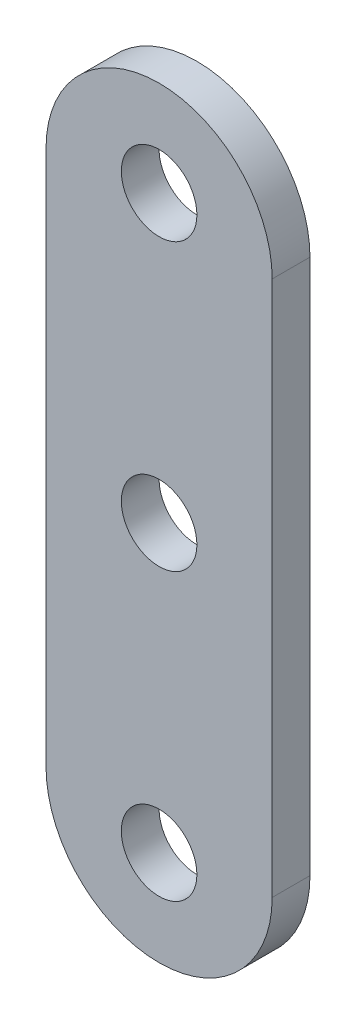
ISO-10303-21;
HEADER;
FILE_DESCRIPTION(('STEP AP214'),'2;1');
FILE_NAME('part.step','',(''),(''),'','','');
FILE_SCHEMA(('AUTOMOTIVE_DESIGN { 1 0 10303 214 1 1 1 1 }'));
ENDSEC;
DATA;
#1=APPLICATION_CONTEXT('core data for automotive mechanical design processes');
#2=APPLICATION_PROTOCOL_DEFINITION('international standard','automotive_design',2000,#1);
#3=PRODUCT_CONTEXT('',#1,'mechanical');
#4=PRODUCT('Part','Part','',(#3));
#5=PRODUCT_RELATED_PRODUCT_CATEGORY('part','',(#4));
#6=PRODUCT_DEFINITION_FORMATION('','',#4);
#7=PRODUCT_DEFINITION_CONTEXT('part definition',#1,'design');
#8=PRODUCT_DEFINITION('design','',#6,#7);
#9=PRODUCT_DEFINITION_SHAPE('','',#8);
#10=(LENGTH_UNIT() NAMED_UNIT(*) SI_UNIT(.MILLI.,.METRE.));
#11=(NAMED_UNIT(*) PLANE_ANGLE_UNIT() SI_UNIT($,.RADIAN.));
#12=(NAMED_UNIT(*) SI_UNIT($,.STERADIAN.) SOLID_ANGLE_UNIT());
#13=UNCERTAINTY_MEASURE_WITH_UNIT(LENGTH_MEASURE(1.E-05),#10,'distance_accuracy_value','');
#14=(GEOMETRIC_REPRESENTATION_CONTEXT(3) GLOBAL_UNCERTAINTY_ASSIGNED_CONTEXT((#13)) GLOBAL_UNIT_ASSIGNED_CONTEXT((#10,
#11,#12)) REPRESENTATION_CONTEXT('',''));
#15=CARTESIAN_POINT('',(0.,0.,0.));
#16=DIRECTION('',(0.,0.,1.));
#17=DIRECTION('',(1.,0.,0.));
#18=AXIS2_PLACEMENT_3D('',#15,#16,#17);
#19=CARTESIAN_POINT('',(0.,-22.5,3.175));
#20=DIRECTION('',(0.,0.,-1.));
#21=DIRECTION('',(-1.,0.,0.));
#22=AXIS2_PLACEMENT_3D('',#19,#20,#21);
#23=CYLINDRICAL_SURFACE('',#22,9.50000000000001);
#24=CARTESIAN_POINT('',(0.,-22.5,0.));
#25=DIRECTION('',(0.,0.,1.));
#26=DIRECTION('',(1.,0.,0.));
#27=AXIS2_PLACEMENT_3D('',#24,#25,#26);
#28=CIRCLE('',#27,9.50000000000001);
#29=CARTESIAN_POINT('',(-9.50000000000001,-22.5,0.));
#30=VERTEX_POINT('',#29);
#31=CARTESIAN_POINT('',(9.50000000000001,-22.5,0.));
#32=VERTEX_POINT('',#31);
#33=EDGE_CURVE('E99',#30,#32,#28,.T.);
#34=ORIENTED_EDGE('',*,*,#33,.T.);
#35=DIRECTION('',(0.,0.,-1.));
#36=VECTOR('',#35,1.);
#37=CARTESIAN_POINT('',(9.50000000000001,-22.5,3.175));
#38=LINE('',#37,#36);
#39=CARTESIAN_POINT('',(9.50000000000001,-22.5,3.175));
#40=VERTEX_POINT('',#39);
#41=EDGE_CURVE('E11',#40,#32,#38,.T.);
#42=ORIENTED_EDGE('',*,*,#41,.F.);
#43=CARTESIAN_POINT('',(0.,-22.5,3.175));
#44=DIRECTION('',(0.,0.,1.));
#45=DIRECTION('',(1.,0.,0.));
#46=AXIS2_PLACEMENT_3D('',#43,#44,#45);
#47=CIRCLE('',#46,9.50000000000001);
#48=CARTESIAN_POINT('',(-9.50000000000001,-22.5,3.175));
#49=VERTEX_POINT('',#48);
#50=EDGE_CURVE('E87',#49,#40,#47,.T.);
#51=ORIENTED_EDGE('',*,*,#50,.F.);
#52=DIRECTION('',(0.,0.,-1.));
#53=VECTOR('',#52,1.);
#54=CARTESIAN_POINT('',(-9.50000000000001,-22.5,3.175));
#55=LINE('',#54,#53);
#56=EDGE_CURVE('E95',#49,#30,#55,.T.);
#57=ORIENTED_EDGE('',*,*,#56,.T.);
#58=EDGE_LOOP('',(#34,#42,#51,#57));
#59=FACE_BOUND('',#58,.T.);
#60=ADVANCED_FACE('F36',(#59),#23,.T.);
#61=CARTESIAN_POINT('',(9.50000000000001,-22.5,3.175));
#62=DIRECTION('',(-1.,0.,0.));
#63=DIRECTION('',(0.,-1.,0.));
#64=AXIS2_PLACEMENT_3D('',#61,#62,#63);
#65=PLANE('',#64);
#66=DIRECTION('',(0.,1.,0.));
#67=VECTOR('',#66,1.);
#68=CARTESIAN_POINT('',(9.50000000000001,-22.5,0.));
#69=LINE('',#68,#67);
#70=CARTESIAN_POINT('',(9.5,22.5,0.));
#71=VERTEX_POINT('',#70);
#72=EDGE_CURVE('E91',#32,#71,#69,.T.);
#73=ORIENTED_EDGE('',*,*,#72,.T.);
#74=DIRECTION('',(0.,0.,-1.));
#75=VECTOR('',#74,1.);
#76=CARTESIAN_POINT('',(9.5,22.5,3.175));
#77=LINE('',#76,#75);
#78=CARTESIAN_POINT('',(9.5,22.5,3.175));
#79=VERTEX_POINT('',#78);
#80=EDGE_CURVE('E44',#79,#71,#77,.T.);
#81=ORIENTED_EDGE('',*,*,#80,.F.);
#82=DIRECTION('',(0.,1.,0.));
#83=VECTOR('',#82,1.);
#84=CARTESIAN_POINT('',(9.50000000000001,-22.5,3.175));
#85=LINE('',#84,#83);
#86=EDGE_CURVE('E82',#40,#79,#85,.T.);
#87=ORIENTED_EDGE('',*,*,#86,.F.);
#88=ORIENTED_EDGE('',*,*,#41,.T.);
#89=EDGE_LOOP('',(#73,#81,#87,#88));
#90=FACE_BOUND('',#89,.T.);
#91=ADVANCED_FACE('F90',(#90),#65,.F.);
#92=CARTESIAN_POINT('',(0.,22.5,3.175));
#93=DIRECTION('',(0.,0.,-1.));
#94=DIRECTION('',(-1.,0.,0.));
#95=AXIS2_PLACEMENT_3D('',#92,#93,#94);
#96=CYLINDRICAL_SURFACE('',#95,9.50000000000001);
#97=CARTESIAN_POINT('',(0.,22.5,0.));
#98=DIRECTION('',(0.,0.,1.));
#99=DIRECTION('',(1.,0.,0.));
#100=AXIS2_PLACEMENT_3D('',#97,#98,#99);
#101=CIRCLE('',#100,9.50000000000001);
#102=CARTESIAN_POINT('',(-9.50000000000002,22.5,0.));
#103=VERTEX_POINT('',#102);
#104=EDGE_CURVE('E69',#71,#103,#101,.T.);
#105=ORIENTED_EDGE('',*,*,#104,.T.);
#106=DIRECTION('',(0.,0.,-1.));
#107=VECTOR('',#106,1.);
#108=CARTESIAN_POINT('',(-9.50000000000002,22.5,3.175));
#109=LINE('',#108,#107);
#110=CARTESIAN_POINT('',(-9.50000000000002,22.5,3.175));
#111=VERTEX_POINT('',#110);
#112=EDGE_CURVE('E92',#111,#103,#109,.T.);
#113=ORIENTED_EDGE('',*,*,#112,.F.);
#114=CARTESIAN_POINT('',(0.,22.5,3.175));
#115=DIRECTION('',(0.,0.,1.));
#116=DIRECTION('',(1.,0.,0.));
#117=AXIS2_PLACEMENT_3D('',#114,#115,#116);
#118=CIRCLE('',#117,9.50000000000001);
#119=EDGE_CURVE('E85',#79,#111,#118,.T.);
#120=ORIENTED_EDGE('',*,*,#119,.F.);
#121=ORIENTED_EDGE('',*,*,#80,.T.);
#122=EDGE_LOOP('',(#105,#113,#120,#121));
#123=FACE_BOUND('',#122,.T.);
#124=ADVANCED_FACE('F93',(#123),#96,.T.);
#125=CARTESIAN_POINT('',(-9.50000000000001,-22.5,3.175));
#126=DIRECTION('',(1.,0.,0.));
#127=DIRECTION('',(0.,1.,0.));
#128=AXIS2_PLACEMENT_3D('',#125,#126,#127);
#129=PLANE('',#128);
#130=DIRECTION('',(0.,-1.,0.));
#131=VECTOR('',#130,1.);
#132=CARTESIAN_POINT('',(-9.50000000000001,-22.5,0.));
#133=LINE('',#132,#131);
#134=EDGE_CURVE('E75',#103,#30,#133,.T.);
#135=ORIENTED_EDGE('',*,*,#134,.T.);
#136=ORIENTED_EDGE('',*,*,#56,.F.);
#137=DIRECTION('',(0.,-1.,0.));
#138=VECTOR('',#137,1.);
#139=CARTESIAN_POINT('',(-9.50000000000001,-22.5,3.175));
#140=LINE('',#139,#138);
#141=EDGE_CURVE('E52',#111,#49,#140,.T.);
#142=ORIENTED_EDGE('',*,*,#141,.F.);
#143=ORIENTED_EDGE('',*,*,#112,.T.);
#144=EDGE_LOOP('',(#135,#136,#142,#143));
#145=FACE_BOUND('',#144,.T.);
#146=ADVANCED_FACE('F107',(#145),#129,.F.);
#147=CARTESIAN_POINT('',(0.,-22.5,3.175));
#148=DIRECTION('',(0.,0.,1.));
#149=DIRECTION('',(1.,0.,0.));
#150=AXIS2_PLACEMENT_3D('',#147,#148,#149);
#151=PLANE('',#150);
#152=CARTESIAN_POINT('',(0.,-24.,3.175));
#153=DIRECTION('',(0.,0.,1.));
#154=DIRECTION('',(1.,0.,0.));
#155=AXIS2_PLACEMENT_3D('',#152,#153,#154);
#156=CIRCLE('',#155,3.175);
#157=CARTESIAN_POINT('',(3.175,-24.,3.175));
#158=VERTEX_POINT('',#157);
#159=EDGE_CURVE('E125',#158,#158,#156,.T.);
#160=ORIENTED_EDGE('',*,*,#159,.F.);
#161=EDGE_LOOP('',(#160));
#162=FACE_BOUND('',#161,.T.);
#163=CARTESIAN_POINT('',(0.,24.,3.175));
#164=DIRECTION('',(0.,0.,1.));
#165=DIRECTION('',(1.,0.,0.));
#166=AXIS2_PLACEMENT_3D('',#163,#164,#165);
#167=CIRCLE('',#166,3.175);
#168=CARTESIAN_POINT('',(3.175,24.,3.175));
#169=VERTEX_POINT('',#168);
#170=EDGE_CURVE('E119',#169,#169,#167,.T.);
#171=ORIENTED_EDGE('',*,*,#170,.F.);
#172=EDGE_LOOP('',(#171));
#173=FACE_BOUND('',#172,.T.);
#174=CARTESIAN_POINT('',(0.,0.,3.175));
#175=DIRECTION('',(0.,0.,1.));
#176=DIRECTION('',(1.,0.,0.));
#177=AXIS2_PLACEMENT_3D('',#174,#175,#176);
#178=CIRCLE('',#177,3.175);
#179=CARTESIAN_POINT('',(3.175,0.,3.175));
#180=VERTEX_POINT('',#179);
#181=EDGE_CURVE('E113',#180,#180,#178,.T.);
#182=ORIENTED_EDGE('',*,*,#181,.F.);
#183=EDGE_LOOP('',(#182));
#184=FACE_BOUND('',#183,.T.);
#185=ORIENTED_EDGE('',*,*,#50,.T.);
#186=ORIENTED_EDGE('',*,*,#86,.T.);
#187=ORIENTED_EDGE('',*,*,#119,.T.);
#188=ORIENTED_EDGE('',*,*,#141,.T.);
#189=EDGE_LOOP('',(#185,#186,#187,#188));
#190=FACE_BOUND('',#189,.T.);
#191=ADVANCED_FACE('F83',(#162,#173,#184,#190),#151,.T.);
#192=CARTESIAN_POINT('',(0.,-22.5,0.));
#193=DIRECTION('',(0.,0.,1.));
#194=DIRECTION('',(1.,0.,0.));
#195=AXIS2_PLACEMENT_3D('',#192,#193,#194);
#196=PLANE('',#195);
#197=CARTESIAN_POINT('',(0.,-24.,0.));
#198=DIRECTION('',(0.,0.,1.));
#199=DIRECTION('',(1.,0.,0.));
#200=AXIS2_PLACEMENT_3D('',#197,#198,#199);
#201=CIRCLE('',#200,3.175);
#202=CARTESIAN_POINT('',(3.175,-24.,0.));
#203=VERTEX_POINT('',#202);
#204=EDGE_CURVE('E116',#203,#203,#201,.T.);
#205=ORIENTED_EDGE('',*,*,#204,.T.);
#206=EDGE_LOOP('',(#205));
#207=FACE_BOUND('',#206,.T.);
#208=CARTESIAN_POINT('',(0.,24.,0.));
#209=DIRECTION('',(0.,0.,1.));
#210=DIRECTION('',(1.,0.,0.));
#211=AXIS2_PLACEMENT_3D('',#208,#209,#210);
#212=CIRCLE('',#211,3.175);
#213=CARTESIAN_POINT('',(3.175,24.,0.));
#214=VERTEX_POINT('',#213);
#215=EDGE_CURVE('E122',#214,#214,#212,.T.);
#216=ORIENTED_EDGE('',*,*,#215,.T.);
#217=EDGE_LOOP('',(#216));
#218=FACE_BOUND('',#217,.T.);
#219=CARTESIAN_POINT('',(0.,0.,0.));
#220=DIRECTION('',(0.,0.,1.));
#221=DIRECTION('',(1.,0.,0.));
#222=AXIS2_PLACEMENT_3D('',#219,#220,#221);
#223=CIRCLE('',#222,3.175);
#224=CARTESIAN_POINT('',(3.175,0.,0.));
#225=VERTEX_POINT('',#224);
#226=EDGE_CURVE('E102',#225,#225,#223,.T.);
#227=ORIENTED_EDGE('',*,*,#226,.T.);
#228=EDGE_LOOP('',(#227));
#229=FACE_BOUND('',#228,.T.);
#230=ORIENTED_EDGE('',*,*,#33,.F.);
#231=ORIENTED_EDGE('',*,*,#134,.F.);
#232=ORIENTED_EDGE('',*,*,#104,.F.);
#233=ORIENTED_EDGE('',*,*,#72,.F.);
#234=EDGE_LOOP('',(#230,#231,#232,#233));
#235=FACE_BOUND('',#234,.T.);
#236=ADVANCED_FACE('F110',(#207,#218,#229,#235),#196,.F.);
#237=CARTESIAN_POINT('',(0.,0.,0.));
#238=DIRECTION('',(0.,0.,1.));
#239=DIRECTION('',(1.,0.,0.));
#240=AXIS2_PLACEMENT_3D('',#237,#238,#239);
#241=CYLINDRICAL_SURFACE('',#240,3.175);
#242=ORIENTED_EDGE('',*,*,#226,.F.);
#243=EDGE_LOOP('',(#242));
#244=FACE_BOUND('',#243,.T.);
#245=ORIENTED_EDGE('',*,*,#181,.T.);
#246=EDGE_LOOP('',(#245));
#247=FACE_BOUND('',#246,.T.);
#248=ADVANCED_FACE('F147',(#244,#247),#241,.F.);
#249=CARTESIAN_POINT('',(0.,24.,0.));
#250=DIRECTION('',(0.,0.,1.));
#251=DIRECTION('',(1.,0.,0.));
#252=AXIS2_PLACEMENT_3D('',#249,#250,#251);
#253=CYLINDRICAL_SURFACE('',#252,3.175);
#254=ORIENTED_EDGE('',*,*,#215,.F.);
#255=EDGE_LOOP('',(#254));
#256=FACE_BOUND('',#255,.T.);
#257=ORIENTED_EDGE('',*,*,#170,.T.);
#258=EDGE_LOOP('',(#257));
#259=FACE_BOUND('',#258,.T.);
#260=ADVANCED_FACE('F136',(#256,#259),#253,.F.);
#261=CARTESIAN_POINT('',(0.,-24.,0.));
#262=DIRECTION('',(0.,0.,1.));
#263=DIRECTION('',(1.,0.,0.));
#264=AXIS2_PLACEMENT_3D('',#261,#262,#263);
#265=CYLINDRICAL_SURFACE('',#264,3.175);
#266=ORIENTED_EDGE('',*,*,#204,.F.);
#267=EDGE_LOOP('',(#266));
#268=FACE_BOUND('',#267,.T.);
#269=ORIENTED_EDGE('',*,*,#159,.T.);
#270=EDGE_LOOP('',(#269));
#271=FACE_BOUND('',#270,.T.);
#272=ADVANCED_FACE('F133',(#268,#271),#265,.F.);
#273=CLOSED_SHELL('',(#60,#91,#124,#146,#191,#236,#248,#260,#272));
#274=MANIFOLD_SOLID_BREP('B2',#273);
#275=ADVANCED_BREP_SHAPE_REPRESENTATION('',(#18,#274),#14);
#276=SHAPE_DEFINITION_REPRESENTATION(#9,#275);
ENDSEC;
END-ISO-10303-21;
